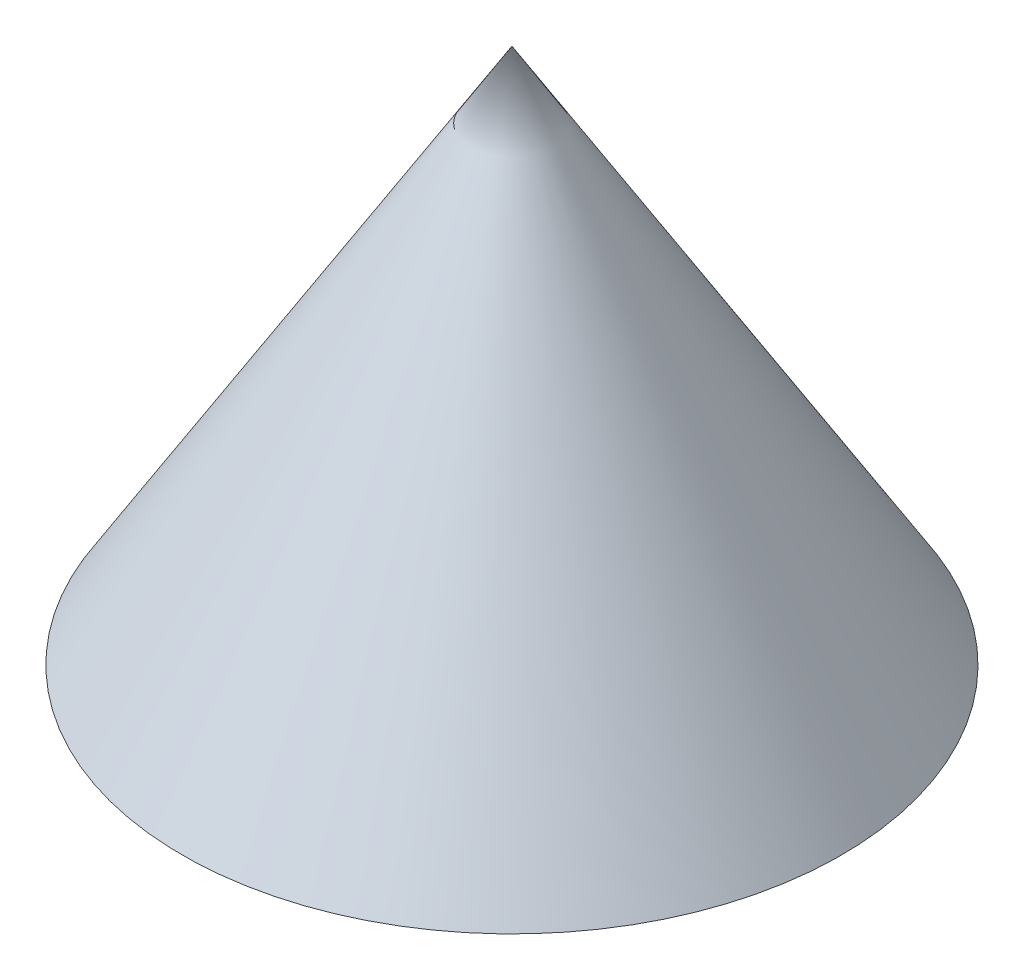
ISO-10303-21;
HEADER;
FILE_DESCRIPTION(('STEP AP214'),'2;1');
FILE_NAME('part.step','',(''),(''),'','','');
FILE_SCHEMA(('AUTOMOTIVE_DESIGN { 1 0 10303 214 1 1 1 1 }'));
ENDSEC;
DATA;
#1=APPLICATION_CONTEXT('core data for automotive mechanical design processes');
#2=APPLICATION_PROTOCOL_DEFINITION('international standard','automotive_design',2000,#1);
#3=PRODUCT_CONTEXT('',#1,'mechanical');
#4=PRODUCT('Part','Part','',(#3));
#5=PRODUCT_RELATED_PRODUCT_CATEGORY('part','',(#4));
#6=PRODUCT_DEFINITION_FORMATION('','',#4);
#7=PRODUCT_DEFINITION_CONTEXT('part definition',#1,'design');
#8=PRODUCT_DEFINITION('design','',#6,#7);
#9=PRODUCT_DEFINITION_SHAPE('','',#8);
#10=(LENGTH_UNIT() NAMED_UNIT(*) SI_UNIT(.MILLI.,.METRE.));
#11=(NAMED_UNIT(*) PLANE_ANGLE_UNIT() SI_UNIT($,.RADIAN.));
#12=(NAMED_UNIT(*) SI_UNIT($,.STERADIAN.) SOLID_ANGLE_UNIT());
#13=UNCERTAINTY_MEASURE_WITH_UNIT(LENGTH_MEASURE(1.E-05),#10,'distance_accuracy_value','');
#14=(GEOMETRIC_REPRESENTATION_CONTEXT(3) GLOBAL_UNCERTAINTY_ASSIGNED_CONTEXT((#13)) GLOBAL_UNIT_ASSIGNED_CONTEXT((#10,
#11,#12)) REPRESENTATION_CONTEXT('',''));
#15=CARTESIAN_POINT('',(0.,0.,0.));
#16=DIRECTION('',(0.,0.,1.));
#17=DIRECTION('',(1.,0.,0.));
#18=AXIS2_PLACEMENT_3D('',#15,#16,#17);
#19=CARTESIAN_POINT('',(26.7957877792336,0.,0.));
#20=DIRECTION('',(0.,-1.,0.));
#21=DIRECTION('',(0.,0.,-1.));
#22=AXIS2_PLACEMENT_3D('',#19,#20,#21);
#23=PLANE('',#22);
#24=CARTESIAN_POINT('',(0.,0.,0.));
#25=DIRECTION('',(0.,-1.,0.));
#26=DIRECTION('',(0.,0.,-1.));
#27=AXIS2_PLACEMENT_3D('',#24,#25,#26);
#28=CIRCLE('',#27,26.7957877792336);
#29=CARTESIAN_POINT('',(0.,0.,-26.7957877792336));
#30=VERTEX_POINT('',#29);
#31=EDGE_CURVE('E11',#30,#30,#28,.T.);
#32=ORIENTED_EDGE('',*,*,#31,.T.);
#33=EDGE_LOOP('',(#32));
#34=FACE_BOUND('',#33,.T.);
#35=ADVANCED_FACE('F34',(#34),#23,.T.);
#36=CARTESIAN_POINT('',(0.,0.,0.));
#37=DIRECTION('',(0.,-1.,0.));
#38=DIRECTION('',(0.,0.,-1.));
#39=AXIS2_PLACEMENT_3D('',#36,#37,#38);
#40=CONICAL_SURFACE('',#39,26.7957877792336,0.551444411885207);
#41=CARTESIAN_POINT('',(0.,43.5637040582632,0.));
#42=VERTEX_POINT('',#41);
#43=VERTEX_LOOP('',#42);
#44=FACE_BOUND('',#43,.T.);
#45=ORIENTED_EDGE('',*,*,#31,.F.);
#46=EDGE_LOOP('',(#45));
#47=FACE_BOUND('',#46,.T.);
#48=ADVANCED_FACE('F41',(#44,#47),#40,.T.);
#49=CLOSED_SHELL('',(#35,#48));
#50=MANIFOLD_SOLID_BREP('B2',#49);
#51=ADVANCED_BREP_SHAPE_REPRESENTATION('',(#18,#50),#14);
#52=SHAPE_DEFINITION_REPRESENTATION(#9,#51);
ENDSEC;
END-ISO-10303-21;
